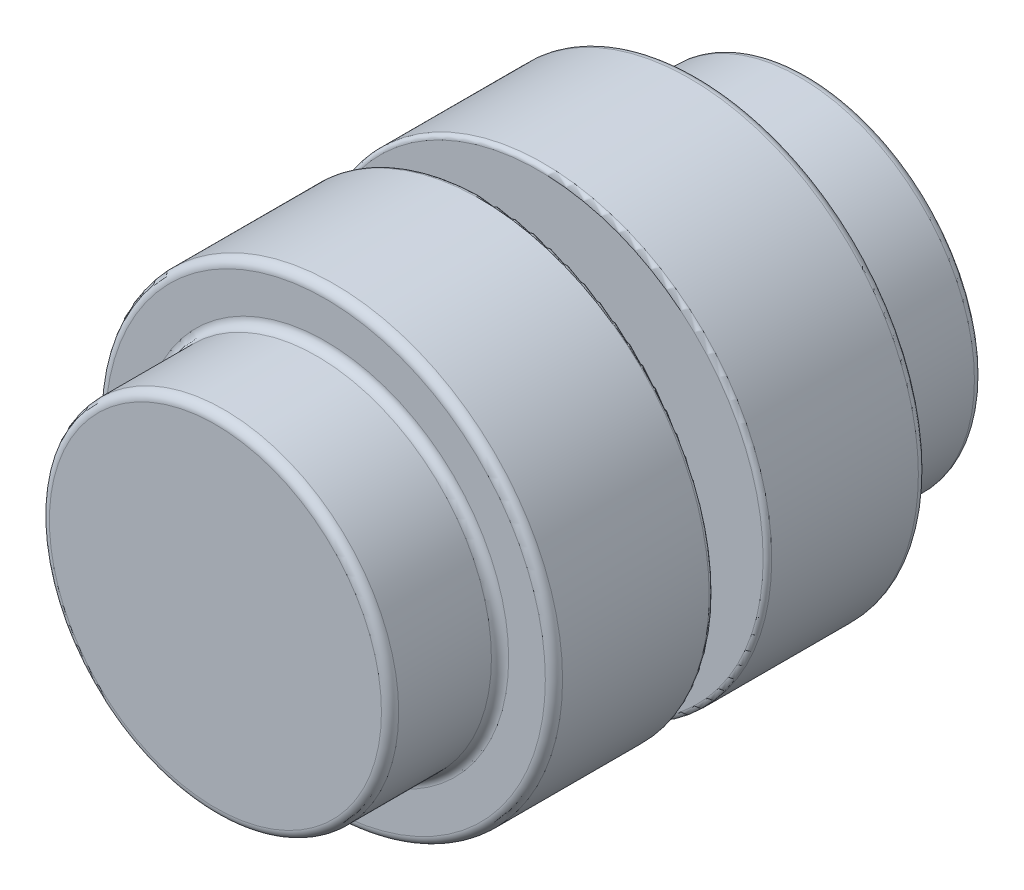
ISO-10303-21;
HEADER;
FILE_DESCRIPTION(('STEP AP214'),'2;1');
FILE_NAME('part.step','',(''),(''),'','','');
FILE_SCHEMA(('AUTOMOTIVE_DESIGN { 1 0 10303 214 1 1 1 1 }'));
ENDSEC;
DATA;
#1=APPLICATION_CONTEXT('core data for automotive mechanical design processes');
#2=APPLICATION_PROTOCOL_DEFINITION('international standard','automotive_design',2000,#1);
#3=PRODUCT_CONTEXT('',#1,'mechanical');
#4=PRODUCT('Part','Part','',(#3));
#5=PRODUCT_RELATED_PRODUCT_CATEGORY('part','',(#4));
#6=PRODUCT_DEFINITION_FORMATION('','',#4);
#7=PRODUCT_DEFINITION_CONTEXT('part definition',#1,'design');
#8=PRODUCT_DEFINITION('design','',#6,#7);
#9=PRODUCT_DEFINITION_SHAPE('','',#8);
#10=(LENGTH_UNIT() NAMED_UNIT(*) SI_UNIT(.MILLI.,.METRE.));
#11=(NAMED_UNIT(*) PLANE_ANGLE_UNIT() SI_UNIT($,.RADIAN.));
#12=(NAMED_UNIT(*) SI_UNIT($,.STERADIAN.) SOLID_ANGLE_UNIT());
#13=UNCERTAINTY_MEASURE_WITH_UNIT(LENGTH_MEASURE(1.E-05),#10,'distance_accuracy_value','');
#14=(GEOMETRIC_REPRESENTATION_CONTEXT(3) GLOBAL_UNCERTAINTY_ASSIGNED_CONTEXT((#13)) GLOBAL_UNIT_ASSIGNED_CONTEXT((#10,
#11,#12)) REPRESENTATION_CONTEXT('',''));
#15=CARTESIAN_POINT('',(0.,0.,0.));
#16=DIRECTION('',(0.,0.,1.));
#17=DIRECTION('',(1.,0.,0.));
#18=AXIS2_PLACEMENT_3D('',#15,#16,#17);
#19=CARTESIAN_POINT('',(0.,0.,-17.4625));
#20=DIRECTION('',(0.,0.,1.));
#21=DIRECTION('',(-1.,0.,0.));
#22=AXIS2_PLACEMENT_3D('',#19,#20,#21);
#23=PLANE('',#22);
#24=CARTESIAN_POINT('',(0.,0.,-17.4625));
#25=DIRECTION('',(0.,0.,1.));
#26=DIRECTION('',(1.,0.,0.));
#27=AXIS2_PLACEMENT_3D('',#24,#25,#26);
#28=CIRCLE('',#27,9.779);
#29=CARTESIAN_POINT('',(9.779,0.,-17.4625));
#30=VERTEX_POINT('',#29);
#31=EDGE_CURVE('E11',#30,#30,#28,.T.);
#32=ORIENTED_EDGE('',*,*,#31,.F.);
#33=EDGE_LOOP('',(#32));
#34=FACE_BOUND('',#33,.T.);
#35=ADVANCED_FACE('F39',(#34),#23,.F.);
#36=CARTESIAN_POINT('',(0.,0.,-16.9545));
#37=DIRECTION('',(0.,0.,-1.));
#38=DIRECTION('',(1.,0.,0.));
#39=AXIS2_PLACEMENT_3D('',#36,#37,#38);
#40=TOROIDAL_SURFACE('',#39,9.779,0.508000000000001);
#41=ORIENTED_EDGE('',*,*,#31,.T.);
#42=EDGE_LOOP('',(#41));
#43=FACE_BOUND('',#42,.T.);
#44=CARTESIAN_POINT('',(0.,0.,-16.9545));
#45=DIRECTION('',(0.,0.,1.));
#46=DIRECTION('',(1.,0.,0.));
#47=AXIS2_PLACEMENT_3D('',#44,#45,#46);
#48=CIRCLE('',#47,10.287);
#49=CARTESIAN_POINT('',(10.287,0.,-16.9545));
#50=VERTEX_POINT('',#49);
#51=EDGE_CURVE('E45',#50,#50,#48,.T.);
#52=ORIENTED_EDGE('',*,*,#51,.F.);
#53=EDGE_LOOP('',(#52));
#54=FACE_BOUND('',#53,.T.);
#55=ADVANCED_FACE('F87',(#43,#54),#40,.T.);
#56=CARTESIAN_POINT('',(0.,0.,-121.497728218886));
#57=DIRECTION('',(0.,0.,-1.));
#58=DIRECTION('',(1.,0.,0.));
#59=AXIS2_PLACEMENT_3D('',#56,#57,#58);
#60=CYLINDRICAL_SURFACE('',#59,10.287);
#61=ORIENTED_EDGE('',*,*,#51,.T.);
#62=EDGE_LOOP('',(#61));
#63=FACE_BOUND('',#62,.T.);
#64=CARTESIAN_POINT('',(0.,0.,-11.4935));
#65=DIRECTION('',(0.,0.,1.));
#66=DIRECTION('',(1.,0.,0.));
#67=AXIS2_PLACEMENT_3D('',#64,#65,#66);
#68=CIRCLE('',#67,10.287);
#69=CARTESIAN_POINT('',(10.287,0.,-11.4935));
#70=VERTEX_POINT('',#69);
#71=EDGE_CURVE('E49',#70,#70,#68,.T.);
#72=ORIENTED_EDGE('',*,*,#71,.F.);
#73=EDGE_LOOP('',(#72));
#74=FACE_BOUND('',#73,.T.);
#75=ADVANCED_FACE('F92',(#63,#74),#60,.T.);
#76=CARTESIAN_POINT('',(0.,0.,-11.4935));
#77=DIRECTION('',(0.,0.,-1.));
#78=DIRECTION('',(1.,0.,0.));
#79=AXIS2_PLACEMENT_3D('',#76,#77,#78);
#80=TOROIDAL_SURFACE('',#79,10.795,0.508);
#81=ORIENTED_EDGE('',*,*,#71,.T.);
#82=EDGE_LOOP('',(#81));
#83=FACE_BOUND('',#82,.T.);
#84=CARTESIAN_POINT('',(0.,0.,-10.9855));
#85=DIRECTION('',(0.,0.,1.));
#86=DIRECTION('',(1.,0.,0.));
#87=AXIS2_PLACEMENT_3D('',#84,#85,#86);
#88=CIRCLE('',#87,10.795);
#89=CARTESIAN_POINT('',(10.795,0.,-10.9855));
#90=VERTEX_POINT('',#89);
#91=EDGE_CURVE('E53',#90,#90,#88,.T.);
#92=ORIENTED_EDGE('',*,*,#91,.F.);
#93=EDGE_LOOP('',(#92));
#94=FACE_BOUND('',#93,.T.);
#95=ADVANCED_FACE('F96',(#83,#94),#80,.F.);
#96=CARTESIAN_POINT('',(0.,10.795,-10.9855));
#97=DIRECTION('',(0.,0.,1.));
#98=DIRECTION('',(-1.,0.,0.));
#99=AXIS2_PLACEMENT_3D('',#96,#97,#98);
#100=PLANE('',#99);
#101=ORIENTED_EDGE('',*,*,#91,.T.);
#102=EDGE_LOOP('',(#101));
#103=FACE_BOUND('',#102,.T.);
#104=CARTESIAN_POINT('',(0.,0.,-10.9855));
#105=DIRECTION('',(0.,0.,1.));
#106=DIRECTION('',(1.,0.,0.));
#107=AXIS2_PLACEMENT_3D('',#104,#105,#106);
#108=CIRCLE('',#107,12.954);
#109=CARTESIAN_POINT('',(12.954,0.,-10.9855));
#110=VERTEX_POINT('',#109);
#111=EDGE_CURVE('E58',#110,#110,#108,.T.);
#112=ORIENTED_EDGE('',*,*,#111,.F.);
#113=EDGE_LOOP('',(#112));
#114=FACE_BOUND('',#113,.T.);
#115=ADVANCED_FACE('F102',(#103,#114),#100,.F.);
#116=CARTESIAN_POINT('',(0.,0.,-10.4775));
#117=DIRECTION('',(0.,0.,-1.));
#118=DIRECTION('',(1.,0.,0.));
#119=AXIS2_PLACEMENT_3D('',#116,#117,#118);
#120=TOROIDAL_SURFACE('',#119,12.954,0.508);
#121=ORIENTED_EDGE('',*,*,#111,.T.);
#122=EDGE_LOOP('',(#121));
#123=FACE_BOUND('',#122,.T.);
#124=CARTESIAN_POINT('',(0.,0.,-10.4775));
#125=DIRECTION('',(0.,0.,1.));
#126=DIRECTION('',(1.,0.,0.));
#127=AXIS2_PLACEMENT_3D('',#124,#125,#126);
#128=CIRCLE('',#127,13.462);
#129=CARTESIAN_POINT('',(13.462,0.,-10.4775));
#130=VERTEX_POINT('',#129);
#131=EDGE_CURVE('E61',#130,#130,#128,.T.);
#132=ORIENTED_EDGE('',*,*,#131,.F.);
#133=EDGE_LOOP('',(#132));
#134=FACE_BOUND('',#133,.T.);
#135=ADVANCED_FACE('F83',(#123,#134),#120,.T.);
#136=CARTESIAN_POINT('',(0.,0.,-121.497728218886));
#137=DIRECTION('',(0.,0.,-1.));
#138=DIRECTION('',(1.,0.,0.));
#139=AXIS2_PLACEMENT_3D('',#136,#137,#138);
#140=CYLINDRICAL_SURFACE('',#139,13.462);
#141=ORIENTED_EDGE('',*,*,#131,.T.);
#142=EDGE_LOOP('',(#141));
#143=FACE_BOUND('',#142,.T.);
#144=CARTESIAN_POINT('',(0.,0.,-1.8415));
#145=DIRECTION('',(0.,0.,1.));
#146=DIRECTION('',(1.,0.,0.));
#147=AXIS2_PLACEMENT_3D('',#144,#145,#146);
#148=CIRCLE('',#147,13.462);
#149=CARTESIAN_POINT('',(13.462,0.,-1.8415));
#150=VERTEX_POINT('',#149);
#151=EDGE_CURVE('E64',#150,#150,#148,.T.);
#152=ORIENTED_EDGE('',*,*,#151,.F.);
#153=EDGE_LOOP('',(#152));
#154=FACE_BOUND('',#153,.T.);
#155=ADVANCED_FACE('F75',(#143,#154),#140,.T.);
#156=CARTESIAN_POINT('',(0.,0.,-1.8415));
#157=DIRECTION('',(0.,0.,-1.));
#158=DIRECTION('',(1.,0.,0.));
#159=AXIS2_PLACEMENT_3D('',#156,#157,#158);
#160=TOROIDAL_SURFACE('',#159,13.208,0.254);
#161=ORIENTED_EDGE('',*,*,#151,.T.);
#162=EDGE_LOOP('',(#161));
#163=FACE_BOUND('',#162,.T.);
#164=CARTESIAN_POINT('',(0.,0.,-1.58749999999999));
#165=DIRECTION('',(0.,0.,1.));
#166=DIRECTION('',(1.,0.,0.));
#167=AXIS2_PLACEMENT_3D('',#164,#165,#166);
#168=CIRCLE('',#167,13.208);
#169=CARTESIAN_POINT('',(13.208,0.,-1.58749999999999));
#170=VERTEX_POINT('',#169);
#171=EDGE_CURVE('E67',#170,#170,#168,.T.);
#172=ORIENTED_EDGE('',*,*,#171,.F.);
#173=EDGE_LOOP('',(#172));
#174=FACE_BOUND('',#173,.T.);
#175=ADVANCED_FACE('F73',(#163,#174),#160,.T.);
#176=CARTESIAN_POINT('',(0.,13.208,-1.5875));
#177=DIRECTION('',(0.,0.,-1.));
#178=DIRECTION('',(1.,0.,0.));
#179=AXIS2_PLACEMENT_3D('',#176,#177,#178);
#180=PLANE('',#179);
#181=ORIENTED_EDGE('',*,*,#171,.T.);
#182=EDGE_LOOP('',(#181));
#183=FACE_BOUND('',#182,.T.);
#184=ADVANCED_FACE('F71',(#183),#180,.F.);
#185=CLOSED_SHELL('',(#35,#55,#75,#95,#115,#135,#155,#175,#184));
#186=MANIFOLD_SOLID_BREP('B2',#185);
#187=CARTESIAN_POINT('',(0.,0.,17.4625));
#188=DIRECTION('',(0.,0.,-1.));
#189=DIRECTION('',(-1.,0.,0.));
#190=AXIS2_PLACEMENT_3D('',#187,#188,#189);
#191=PLANE('',#190);
#192=CARTESIAN_POINT('',(0.,0.,17.4625));
#193=DIRECTION('',(0.,0.,1.));
#194=DIRECTION('',(1.,0.,0.));
#195=AXIS2_PLACEMENT_3D('',#192,#193,#194);
#196=CIRCLE('',#195,9.779);
#197=CARTESIAN_POINT('',(9.779,0.,17.4625));
#198=VERTEX_POINT('',#197);
#199=EDGE_CURVE('E38',#198,#198,#196,.T.);
#200=ORIENTED_EDGE('',*,*,#199,.T.);
#201=EDGE_LOOP('',(#200));
#202=FACE_BOUND('',#201,.T.);
#203=ADVANCED_FACE('F170',(#202),#191,.F.);
#204=CARTESIAN_POINT('',(0.,0.,16.9545));
#205=DIRECTION('',(0.,0.,1.));
#206=DIRECTION('',(1.,0.,0.));
#207=AXIS2_PLACEMENT_3D('',#204,#205,#206);
#208=TOROIDAL_SURFACE('',#207,9.779,0.508000000000001);
#209=ORIENTED_EDGE('',*,*,#199,.F.);
#210=EDGE_LOOP('',(#209));
#211=FACE_BOUND('',#210,.T.);
#212=CARTESIAN_POINT('',(0.,0.,16.9545));
#213=DIRECTION('',(0.,0.,1.));
#214=DIRECTION('',(1.,0.,0.));
#215=AXIS2_PLACEMENT_3D('',#212,#213,#214);
#216=CIRCLE('',#215,10.287);
#217=CARTESIAN_POINT('',(10.287,0.,16.9545));
#218=VERTEX_POINT('',#217);
#219=EDGE_CURVE('E176',#218,#218,#216,.T.);
#220=ORIENTED_EDGE('',*,*,#219,.T.);
#221=EDGE_LOOP('',(#220));
#222=FACE_BOUND('',#221,.T.);
#223=ADVANCED_FACE('F214',(#211,#222),#208,.T.);
#224=CARTESIAN_POINT('',(0.,0.,121.497728218886));
#225=DIRECTION('',(0.,0.,1.));
#226=DIRECTION('',(1.,0.,0.));
#227=AXIS2_PLACEMENT_3D('',#224,#225,#226);
#228=CYLINDRICAL_SURFACE('',#227,10.287);
#229=ORIENTED_EDGE('',*,*,#219,.F.);
#230=EDGE_LOOP('',(#229));
#231=FACE_BOUND('',#230,.T.);
#232=CARTESIAN_POINT('',(0.,0.,11.4935));
#233=DIRECTION('',(0.,0.,1.));
#234=DIRECTION('',(1.,0.,0.));
#235=AXIS2_PLACEMENT_3D('',#232,#233,#234);
#236=CIRCLE('',#235,10.287);
#237=CARTESIAN_POINT('',(10.287,0.,11.4935));
#238=VERTEX_POINT('',#237);
#239=EDGE_CURVE('E180',#238,#238,#236,.T.);
#240=ORIENTED_EDGE('',*,*,#239,.T.);
#241=EDGE_LOOP('',(#240));
#242=FACE_BOUND('',#241,.T.);
#243=ADVANCED_FACE('F218',(#231,#242),#228,.T.);
#244=CARTESIAN_POINT('',(0.,0.,11.4935));
#245=DIRECTION('',(0.,0.,1.));
#246=DIRECTION('',(1.,0.,0.));
#247=AXIS2_PLACEMENT_3D('',#244,#245,#246);
#248=TOROIDAL_SURFACE('',#247,10.795,0.508);
#249=ORIENTED_EDGE('',*,*,#239,.F.);
#250=EDGE_LOOP('',(#249));
#251=FACE_BOUND('',#250,.T.);
#252=CARTESIAN_POINT('',(0.,0.,10.9855));
#253=DIRECTION('',(0.,0.,1.));
#254=DIRECTION('',(1.,0.,0.));
#255=AXIS2_PLACEMENT_3D('',#252,#253,#254);
#256=CIRCLE('',#255,10.795);
#257=CARTESIAN_POINT('',(10.795,0.,10.9855));
#258=VERTEX_POINT('',#257);
#259=EDGE_CURVE('E184',#258,#258,#256,.T.);
#260=ORIENTED_EDGE('',*,*,#259,.T.);
#261=EDGE_LOOP('',(#260));
#262=FACE_BOUND('',#261,.T.);
#263=ADVANCED_FACE('F223',(#251,#262),#248,.F.);
#264=CARTESIAN_POINT('',(0.,10.795,10.9855));
#265=DIRECTION('',(0.,0.,-1.));
#266=DIRECTION('',(-1.,0.,0.));
#267=AXIS2_PLACEMENT_3D('',#264,#265,#266);
#268=PLANE('',#267);
#269=ORIENTED_EDGE('',*,*,#259,.F.);
#270=EDGE_LOOP('',(#269));
#271=FACE_BOUND('',#270,.T.);
#272=CARTESIAN_POINT('',(0.,0.,10.9855));
#273=DIRECTION('',(0.,0.,1.));
#274=DIRECTION('',(1.,0.,0.));
#275=AXIS2_PLACEMENT_3D('',#272,#273,#274);
#276=CIRCLE('',#275,12.954);
#277=CARTESIAN_POINT('',(12.954,0.,10.9855));
#278=VERTEX_POINT('',#277);
#279=EDGE_CURVE('E189',#278,#278,#276,.T.);
#280=ORIENTED_EDGE('',*,*,#279,.T.);
#281=EDGE_LOOP('',(#280));
#282=FACE_BOUND('',#281,.T.);
#283=ADVANCED_FACE('F229',(#271,#282),#268,.F.);
#284=CARTESIAN_POINT('',(0.,0.,10.4775));
#285=DIRECTION('',(0.,0.,1.));
#286=DIRECTION('',(1.,0.,0.));
#287=AXIS2_PLACEMENT_3D('',#284,#285,#286);
#288=TOROIDAL_SURFACE('',#287,12.954,0.508);
#289=ORIENTED_EDGE('',*,*,#279,.F.);
#290=EDGE_LOOP('',(#289));
#291=FACE_BOUND('',#290,.T.);
#292=CARTESIAN_POINT('',(0.,0.,10.4775));
#293=DIRECTION('',(0.,0.,1.));
#294=DIRECTION('',(1.,0.,0.));
#295=AXIS2_PLACEMENT_3D('',#292,#293,#294);
#296=CIRCLE('',#295,13.462);
#297=CARTESIAN_POINT('',(13.462,0.,10.4775));
#298=VERTEX_POINT('',#297);
#299=EDGE_CURVE('E192',#298,#298,#296,.T.);
#300=ORIENTED_EDGE('',*,*,#299,.T.);
#301=EDGE_LOOP('',(#300));
#302=FACE_BOUND('',#301,.T.);
#303=ADVANCED_FACE('F233',(#291,#302),#288,.T.);
#304=CARTESIAN_POINT('',(0.,0.,121.497728218886));
#305=DIRECTION('',(0.,0.,1.));
#306=DIRECTION('',(1.,0.,0.));
#307=AXIS2_PLACEMENT_3D('',#304,#305,#306);
#308=CYLINDRICAL_SURFACE('',#307,13.462);
#309=ORIENTED_EDGE('',*,*,#299,.F.);
#310=EDGE_LOOP('',(#309));
#311=FACE_BOUND('',#310,.T.);
#312=CARTESIAN_POINT('',(0.,0.,1.8415));
#313=DIRECTION('',(0.,0.,1.));
#314=DIRECTION('',(1.,0.,0.));
#315=AXIS2_PLACEMENT_3D('',#312,#313,#314);
#316=CIRCLE('',#315,13.462);
#317=CARTESIAN_POINT('',(13.462,0.,1.8415));
#318=VERTEX_POINT('',#317);
#319=EDGE_CURVE('E195',#318,#318,#316,.T.);
#320=ORIENTED_EDGE('',*,*,#319,.T.);
#321=EDGE_LOOP('',(#320));
#322=FACE_BOUND('',#321,.T.);
#323=ADVANCED_FACE('F210',(#311,#322),#308,.T.);
#324=CARTESIAN_POINT('',(0.,0.,1.8415));
#325=DIRECTION('',(0.,0.,1.));
#326=DIRECTION('',(1.,0.,0.));
#327=AXIS2_PLACEMENT_3D('',#324,#325,#326);
#328=TOROIDAL_SURFACE('',#327,13.208,0.254);
#329=ORIENTED_EDGE('',*,*,#319,.F.);
#330=EDGE_LOOP('',(#329));
#331=FACE_BOUND('',#330,.T.);
#332=CARTESIAN_POINT('',(0.,0.,1.58749999999999));
#333=DIRECTION('',(0.,0.,1.));
#334=DIRECTION('',(1.,0.,0.));
#335=AXIS2_PLACEMENT_3D('',#332,#333,#334);
#336=CIRCLE('',#335,13.208);
#337=CARTESIAN_POINT('',(13.208,0.,1.58749999999999));
#338=VERTEX_POINT('',#337);
#339=EDGE_CURVE('E198',#338,#338,#336,.T.);
#340=ORIENTED_EDGE('',*,*,#339,.T.);
#341=EDGE_LOOP('',(#340));
#342=FACE_BOUND('',#341,.T.);
#343=ADVANCED_FACE('F202',(#331,#342),#328,.T.);
#344=CARTESIAN_POINT('',(0.,13.208,1.5875));
#345=DIRECTION('',(0.,0.,1.));
#346=DIRECTION('',(1.,0.,0.));
#347=AXIS2_PLACEMENT_3D('',#344,#345,#346);
#348=PLANE('',#347);
#349=ORIENTED_EDGE('',*,*,#339,.F.);
#350=EDGE_LOOP('',(#349));
#351=FACE_BOUND('',#350,.T.);
#352=ADVANCED_FACE('F204',(#351),#348,.F.);
#353=CLOSED_SHELL('',(#203,#223,#243,#263,#283,#303,#323,#343,#352));
#354=MANIFOLD_SOLID_BREP('B6',#353);
#355=ADVANCED_BREP_SHAPE_REPRESENTATION('',(#18,#186,#354),#14);
#356=SHAPE_DEFINITION_REPRESENTATION(#9,#355);
ENDSEC;
END-ISO-10303-21;
